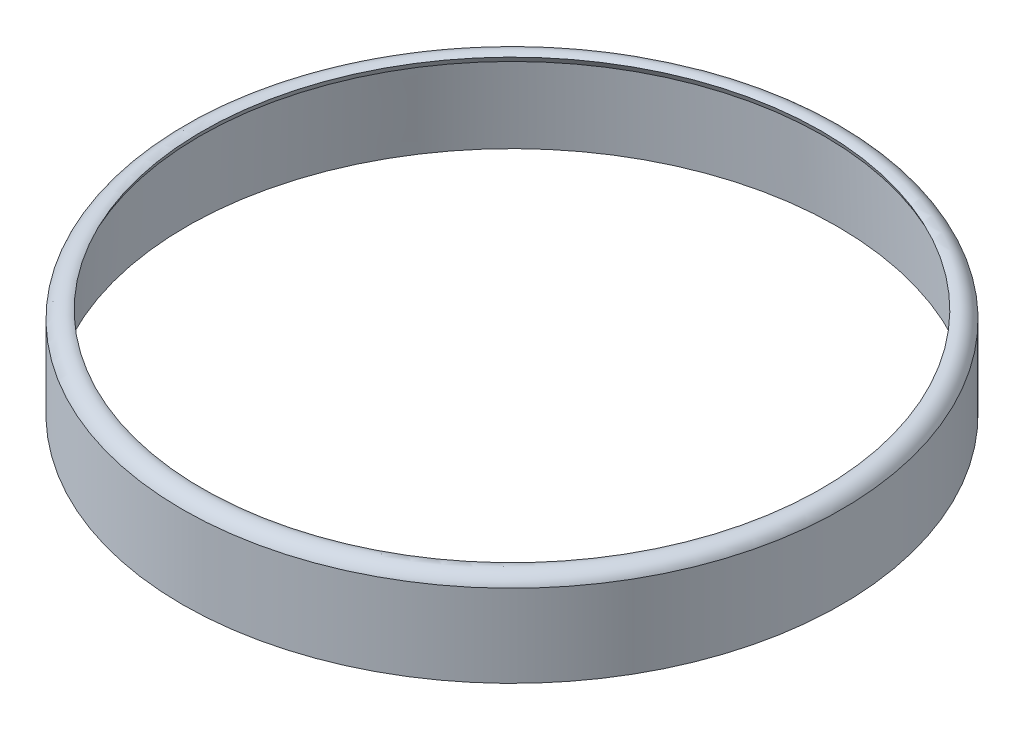
ISO-10303-21;
HEADER;
FILE_DESCRIPTION(('STEP AP214'),'2;1');
FILE_NAME('part.step','',(''),(''),'','','');
FILE_SCHEMA(('AUTOMOTIVE_DESIGN { 1 0 10303 214 1 1 1 1 }'));
ENDSEC;
DATA;
#1=APPLICATION_CONTEXT('core data for automotive mechanical design processes');
#2=APPLICATION_PROTOCOL_DEFINITION('international standard','automotive_design',2000,#1);
#3=PRODUCT_CONTEXT('',#1,'mechanical');
#4=PRODUCT('Part','Part','',(#3));
#5=PRODUCT_RELATED_PRODUCT_CATEGORY('part','',(#4));
#6=PRODUCT_DEFINITION_FORMATION('','',#4);
#7=PRODUCT_DEFINITION_CONTEXT('part definition',#1,'design');
#8=PRODUCT_DEFINITION('design','',#6,#7);
#9=PRODUCT_DEFINITION_SHAPE('','',#8);
#10=(LENGTH_UNIT() NAMED_UNIT(*) SI_UNIT(.MILLI.,.METRE.));
#11=(NAMED_UNIT(*) PLANE_ANGLE_UNIT() SI_UNIT($,.RADIAN.));
#12=(NAMED_UNIT(*) SI_UNIT($,.STERADIAN.) SOLID_ANGLE_UNIT());
#13=UNCERTAINTY_MEASURE_WITH_UNIT(LENGTH_MEASURE(1.E-05),#10,'distance_accuracy_value','');
#14=(GEOMETRIC_REPRESENTATION_CONTEXT(3) GLOBAL_UNCERTAINTY_ASSIGNED_CONTEXT((#13)) GLOBAL_UNIT_ASSIGNED_CONTEXT((#10,
#11,#12)) REPRESENTATION_CONTEXT('',''));
#15=CARTESIAN_POINT('',(0.,0.,0.));
#16=DIRECTION('',(0.,0.,1.));
#17=DIRECTION('',(1.,0.,0.));
#18=AXIS2_PLACEMENT_3D('',#15,#16,#17);
#19=CARTESIAN_POINT('',(-160.000324379273,0.,0.));
#20=DIRECTION('',(0.,1.,0.));
#21=DIRECTION('',(0.,0.,1.));
#22=AXIS2_PLACEMENT_3D('',#19,#20,#21);
#23=PLANE('',#22);
#24=CARTESIAN_POINT('',(0.,0.,0.));
#25=DIRECTION('',(0.,-1.,0.));
#26=DIRECTION('',(0.,0.,-1.));
#27=AXIS2_PLACEMENT_3D('',#24,#25,#26);
#28=CIRCLE('',#27,158.000324379273);
#29=CARTESIAN_POINT('',(0.,0.,-158.000324379273));
#30=VERTEX_POINT('',#29);
#31=EDGE_CURVE('E52',#30,#30,#28,.T.);
#32=ORIENTED_EDGE('',*,*,#31,.F.);
#33=EDGE_LOOP('',(#32));
#34=FACE_BOUND('',#33,.T.);
#35=CARTESIAN_POINT('',(0.,0.,0.));
#36=DIRECTION('',(0.,-1.,0.));
#37=DIRECTION('',(0.,0.,-1.));
#38=AXIS2_PLACEMENT_3D('',#35,#36,#37);
#39=CIRCLE('',#38,160.000324379273);
#40=CARTESIAN_POINT('',(0.,0.,-160.000324379273));
#41=VERTEX_POINT('',#40);
#42=EDGE_CURVE('E10',#41,#41,#39,.T.);
#43=ORIENTED_EDGE('',*,*,#42,.T.);
#44=EDGE_LOOP('',(#43));
#45=FACE_BOUND('',#44,.T.);
#46=ADVANCED_FACE('F30',(#34,#45),#23,.F.);
#47=CARTESIAN_POINT('',(0.,0.,0.));
#48=DIRECTION('',(0.,-1.,0.));
#49=DIRECTION('',(0.,0.,-1.));
#50=AXIS2_PLACEMENT_3D('',#47,#48,#49);
#51=CYLINDRICAL_SURFACE('',#50,160.000324379273);
#52=ORIENTED_EDGE('',*,*,#42,.F.);
#53=EDGE_LOOP('',(#52));
#54=FACE_BOUND('',#53,.T.);
#55=CARTESIAN_POINT('',(0.,40.,0.));
#56=DIRECTION('',(0.,-1.,0.));
#57=DIRECTION('',(0.,0.,-1.));
#58=AXIS2_PLACEMENT_3D('',#55,#56,#57);
#59=CIRCLE('',#58,160.000324379273);
#60=CARTESIAN_POINT('',(0.,40.,-160.000324379273));
#61=VERTEX_POINT('',#60);
#62=EDGE_CURVE('E36',#61,#61,#59,.T.);
#63=ORIENTED_EDGE('',*,*,#62,.T.);
#64=EDGE_LOOP('',(#63));
#65=FACE_BOUND('',#64,.T.);
#66=ADVANCED_FACE('F59',(#54,#65),#51,.T.);
#67=CARTESIAN_POINT('',(0.,37.4600431769936,0.));
#68=DIRECTION('',(0.,-1.,0.));
#69=DIRECTION('',(0.,0.,-1.));
#70=AXIS2_PLACEMENT_3D('',#67,#68,#69);
#71=TOROIDAL_SURFACE('',#70,153.34188925778,7.1264394286255);
#72=ORIENTED_EDGE('',*,*,#62,.F.);
#73=EDGE_LOOP('',(#72));
#74=FACE_BOUND('',#73,.T.);
#75=CARTESIAN_POINT('',(0.,43.9097691972476,0.));
#76=DIRECTION('',(0.,-1.,0.));
#77=DIRECTION('',(0.,0.,-1.));
#78=AXIS2_PLACEMENT_3D('',#75,#76,#77);
#79=CIRCLE('',#78,150.310854254101);
#80=CARTESIAN_POINT('',(0.,43.9097691972476,-150.310854254101));
#81=VERTEX_POINT('',#80);
#82=EDGE_CURVE('E40',#81,#81,#79,.T.);
#83=ORIENTED_EDGE('',*,*,#82,.T.);
#84=EDGE_LOOP('',(#83));
#85=FACE_BOUND('',#84,.T.);
#86=ADVANCED_FACE('F63',(#74,#85),#71,.T.);
#87=CARTESIAN_POINT('',(0.,41.1789736226688,0.));
#88=DIRECTION('',(0.,-1.,0.));
#89=DIRECTION('',(0.,0.,-1.));
#90=AXIS2_PLACEMENT_3D('',#87,#88,#89);
#91=CONICAL_SURFACE('',#90,151.594185817092,0.439318188211905);
#92=ORIENTED_EDGE('',*,*,#82,.F.);
#93=EDGE_LOOP('',(#92));
#94=FACE_BOUND('',#93,.T.);
#95=CARTESIAN_POINT('',(0.,41.1789736226688,0.));
#96=DIRECTION('',(0.,-1.,0.));
#97=DIRECTION('',(0.,0.,-1.));
#98=AXIS2_PLACEMENT_3D('',#95,#96,#97);
#99=CIRCLE('',#98,151.594185817092);
#100=CARTESIAN_POINT('',(0.,41.1789736226688,-151.594185817092));
#101=VERTEX_POINT('',#100);
#102=EDGE_CURVE('E44',#101,#101,#99,.T.);
#103=ORIENTED_EDGE('',*,*,#102,.T.);
#104=EDGE_LOOP('',(#103));
#105=FACE_BOUND('',#104,.T.);
#106=ADVANCED_FACE('F68',(#94,#105),#91,.F.);
#107=CARTESIAN_POINT('',(0.,31.7493711782831,0.));
#108=DIRECTION('',(0.,-1.,0.));
#109=DIRECTION('',(0.,0.,-1.));
#110=AXIS2_PLACEMENT_3D('',#107,#108,#109);
#111=TOROIDAL_SURFACE('',#110,151.738086437102,9.43070037948431);
#112=ORIENTED_EDGE('',*,*,#102,.F.);
#113=EDGE_LOOP('',(#112));
#114=FACE_BOUND('',#113,.T.);
#115=CARTESIAN_POINT('',(0.,40.,0.));
#116=DIRECTION('',(0.,-1.,0.));
#117=DIRECTION('',(0.,0.,-1.));
#118=AXIS2_PLACEMENT_3D('',#115,#116,#117);
#119=CIRCLE('',#118,156.305934255699);
#120=CARTESIAN_POINT('',(0.,40.,-156.305934255699));
#121=VERTEX_POINT('',#120);
#122=EDGE_CURVE('E49',#121,#121,#119,.T.);
#123=ORIENTED_EDGE('',*,*,#122,.T.);
#124=EDGE_LOOP('',(#123));
#125=FACE_BOUND('',#124,.T.);
#126=ADVANCED_FACE('F74',(#114,#125),#111,.F.);
#127=CARTESIAN_POINT('',(0.,0.,0.));
#128=DIRECTION('',(0.,-1.,0.));
#129=DIRECTION('',(0.,0.,-1.));
#130=AXIS2_PLACEMENT_3D('',#127,#128,#129);
#131=CONICAL_SURFACE('',#130,158.000324379273,0.0423344442757582);
#132=ORIENTED_EDGE('',*,*,#122,.F.);
#133=EDGE_LOOP('',(#132));
#134=FACE_BOUND('',#133,.T.);
#135=ORIENTED_EDGE('',*,*,#31,.T.);
#136=EDGE_LOOP('',(#135));
#137=FACE_BOUND('',#136,.T.);
#138=ADVANCED_FACE('F56',(#134,#137),#131,.F.);
#139=CLOSED_SHELL('',(#46,#66,#86,#106,#126,#138));
#140=MANIFOLD_SOLID_BREP('B2',#139);
#141=ADVANCED_BREP_SHAPE_REPRESENTATION('',(#18,#140),#14);
#142=SHAPE_DEFINITION_REPRESENTATION(#9,#141);
ENDSEC;
END-ISO-10303-21;
